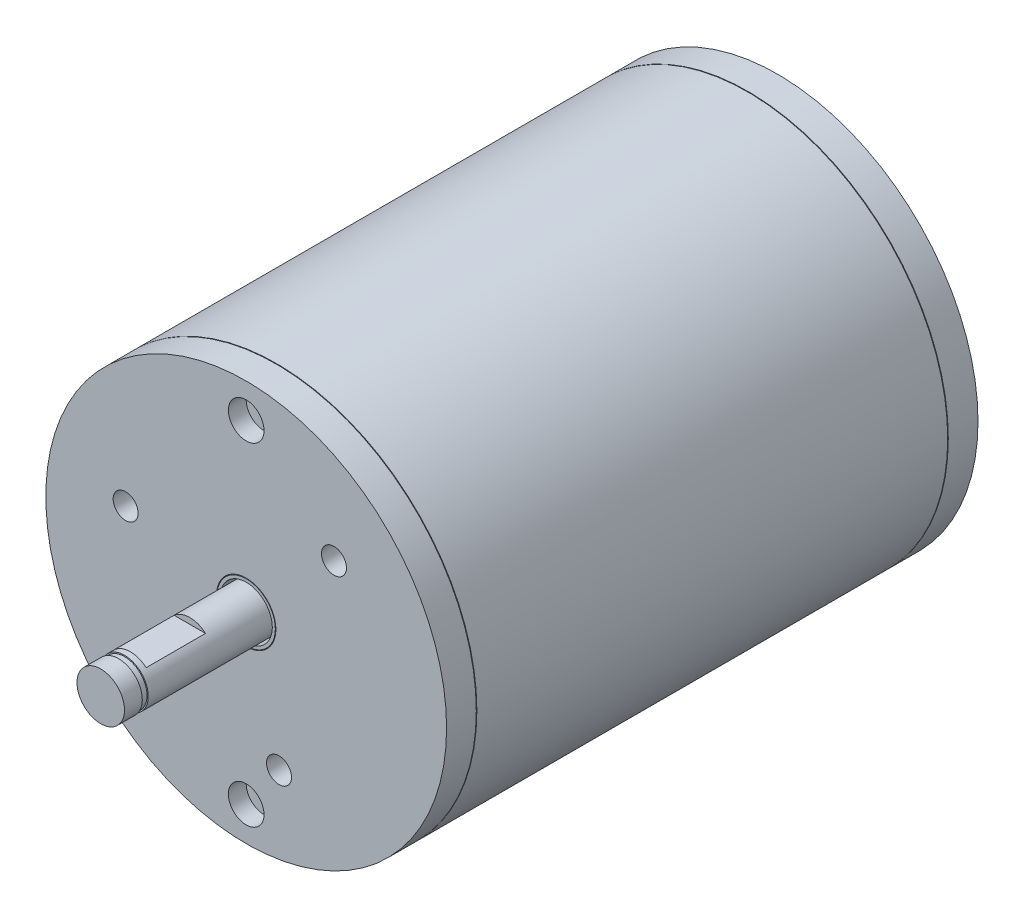
ISO-10303-21;
HEADER;
FILE_DESCRIPTION(('STEP AP214'),'2;1');
FILE_NAME('part.step','',(''),(''),'','','');
FILE_SCHEMA(('AUTOMOTIVE_DESIGN { 1 0 10303 214 1 1 1 1 }'));
ENDSEC;
DATA;
#1=APPLICATION_CONTEXT('core data for automotive mechanical design processes');
#2=APPLICATION_PROTOCOL_DEFINITION('international standard','automotive_design',2000,#1);
#3=PRODUCT_CONTEXT('',#1,'mechanical');
#4=PRODUCT('Part','Part','',(#3));
#5=PRODUCT_RELATED_PRODUCT_CATEGORY('part','',(#4));
#6=PRODUCT_DEFINITION_FORMATION('','',#4);
#7=PRODUCT_DEFINITION_CONTEXT('part definition',#1,'design');
#8=PRODUCT_DEFINITION('design','',#6,#7);
#9=PRODUCT_DEFINITION_SHAPE('','',#8);
#10=(LENGTH_UNIT() NAMED_UNIT(*) SI_UNIT(.MILLI.,.METRE.));
#11=(NAMED_UNIT(*) PLANE_ANGLE_UNIT() SI_UNIT($,.RADIAN.));
#12=(NAMED_UNIT(*) SI_UNIT($,.STERADIAN.) SOLID_ANGLE_UNIT());
#13=UNCERTAINTY_MEASURE_WITH_UNIT(LENGTH_MEASURE(1.E-05),#10,'distance_accuracy_value','');
#14=(GEOMETRIC_REPRESENTATION_CONTEXT(3) GLOBAL_UNCERTAINTY_ASSIGNED_CONTEXT((#13)) GLOBAL_UNIT_ASSIGNED_CONTEXT((#10,
#11,#12)) REPRESENTATION_CONTEXT('',''));
#15=CARTESIAN_POINT('',(0.,0.,0.));
#16=DIRECTION('',(0.,0.,1.));
#17=DIRECTION('',(1.,0.,0.));
#18=AXIS2_PLACEMENT_3D('',#15,#16,#17);
#19=CARTESIAN_POINT('',(0.,0.,109.));
#20=DIRECTION('',(0.,0.,-1.));
#21=DIRECTION('',(-1.,0.,0.));
#22=AXIS2_PLACEMENT_3D('',#19,#20,#21);
#23=CYLINDRICAL_SURFACE('',#22,4.);
#24=CARTESIAN_POINT('',(0.,0.,84.5));
#25=DIRECTION('',(0.,0.,1.));
#26=DIRECTION('',(1.,0.,0.));
#27=AXIS2_PLACEMENT_3D('',#24,#25,#26);
#28=CIRCLE('',#27,4.);
#29=CARTESIAN_POINT('',(4.,0.,84.5));
#30=VERTEX_POINT('',#29);
#31=EDGE_CURVE('E123',#30,#30,#28,.T.);
#32=ORIENTED_EDGE('',*,*,#31,.T.);
#33=EDGE_LOOP('',(#32));
#34=FACE_BOUND('',#33,.T.);
#35=CARTESIAN_POINT('',(0.,0.,99.));
#36=DIRECTION('',(0.,0.,1.));
#37=DIRECTION('',(1.,0.,0.));
#38=AXIS2_PLACEMENT_3D('',#35,#36,#37);
#39=CIRCLE('',#38,4.);
#40=CARTESIAN_POINT('',(2.64575131106459,3.,99.));
#41=VERTEX_POINT('',#40);
#42=CARTESIAN_POINT('',(-2.64575131106459,3.,99.));
#43=VERTEX_POINT('',#42);
#44=EDGE_CURVE('E44',#41,#43,#39,.T.);
#45=ORIENTED_EDGE('',*,*,#44,.F.);
#46=DIRECTION('',(0.,0.,-1.));
#47=VECTOR('',#46,1.);
#48=CARTESIAN_POINT('',(2.64575131106459,3.,109.));
#49=LINE('',#48,#47);
#50=CARTESIAN_POINT('',(2.64575131106459,3.,109.));
#51=VERTEX_POINT('',#50);
#52=EDGE_CURVE('E83',#51,#41,#49,.T.);
#53=ORIENTED_EDGE('',*,*,#52,.F.);
#54=CARTESIAN_POINT('',(0.,0.,109.));
#55=DIRECTION('',(0.,0.,1.));
#56=DIRECTION('',(1.,0.,0.));
#57=AXIS2_PLACEMENT_3D('',#54,#55,#56);
#58=CIRCLE('',#57,4.);
#59=CARTESIAN_POINT('',(-2.64575131106459,3.,109.));
#60=VERTEX_POINT('',#59);
#61=EDGE_CURVE('E88',#51,#60,#58,.T.);
#62=ORIENTED_EDGE('',*,*,#61,.T.);
#63=DIRECTION('',(0.,0.,-1.));
#64=VECTOR('',#63,1.);
#65=CARTESIAN_POINT('',(-2.64575131106459,3.,109.));
#66=LINE('',#65,#64);
#67=EDGE_CURVE('E73',#43,#60,#66,.F.);
#68=ORIENTED_EDGE('',*,*,#67,.F.);
#69=EDGE_LOOP('',(#45,#53,#62,#68));
#70=FACE_BOUND('',#69,.T.);
#71=CARTESIAN_POINT('',(0.,0.,110.));
#72=DIRECTION('',(0.,0.,1.));
#73=DIRECTION('',(1.,0.,0.));
#74=AXIS2_PLACEMENT_3D('',#71,#72,#73);
#75=CIRCLE('',#74,4.);
#76=CARTESIAN_POINT('',(4.,0.,110.));
#77=VERTEX_POINT('',#76);
#78=EDGE_CURVE('E91',#77,#77,#75,.T.);
#79=ORIENTED_EDGE('',*,*,#78,.F.);
#80=EDGE_LOOP('',(#79));
#81=FACE_BOUND('',#80,.T.);
#82=ADVANCED_FACE('F40',(#34,#70,#81),#23,.T.);
#83=CARTESIAN_POINT('',(0.,0.,5.));
#84=DIRECTION('',(0.,0.,-1.));
#85=DIRECTION('',(-1.,0.,0.));
#86=AXIS2_PLACEMENT_3D('',#83,#84,#85);
#87=CYLINDRICAL_SURFACE('',#86,33.75);
#88=CARTESIAN_POINT('',(0.,0.,5.));
#89=DIRECTION('',(0.,0.,1.));
#90=DIRECTION('',(1.,0.,0.));
#91=AXIS2_PLACEMENT_3D('',#88,#89,#90);
#92=CIRCLE('',#91,33.75);
#93=CARTESIAN_POINT('',(33.75,0.,5.));
#94=VERTEX_POINT('',#93);
#95=EDGE_CURVE('E169',#94,#94,#92,.T.);
#96=ORIENTED_EDGE('',*,*,#95,.F.);
#97=EDGE_LOOP('',(#96));
#98=FACE_BOUND('',#97,.T.);
#99=CARTESIAN_POINT('',(0.,0.,0.));
#100=DIRECTION('',(0.,0.,1.));
#101=DIRECTION('',(1.,0.,0.));
#102=AXIS2_PLACEMENT_3D('',#99,#100,#101);
#103=CIRCLE('',#102,33.75);
#104=CARTESIAN_POINT('',(33.75,0.,0.));
#105=VERTEX_POINT('',#104);
#106=EDGE_CURVE('E166',#105,#105,#103,.T.);
#107=ORIENTED_EDGE('',*,*,#106,.T.);
#108=EDGE_LOOP('',(#107));
#109=FACE_BOUND('',#108,.T.);
#110=ADVANCED_FACE('F42',(#98,#109),#87,.T.);
#111=CARTESIAN_POINT('',(0.,0.,5.));
#112=DIRECTION('',(0.,0.,1.));
#113=DIRECTION('',(1.,0.,0.));
#114=AXIS2_PLACEMENT_3D('',#111,#112,#113);
#115=PLANE('',#114);
#116=CARTESIAN_POINT('',(0.,0.,5.));
#117=DIRECTION('',(0.,0.,1.));
#118=DIRECTION('',(1.,0.,0.));
#119=AXIS2_PLACEMENT_3D('',#116,#117,#118);
#120=CIRCLE('',#119,33.6);
#121=CARTESIAN_POINT('',(33.6,0.,5.));
#122=VERTEX_POINT('',#121);
#123=EDGE_CURVE('E157',#122,#122,#120,.T.);
#124=ORIENTED_EDGE('',*,*,#123,.F.);
#125=EDGE_LOOP('',(#124));
#126=FACE_BOUND('',#125,.T.);
#127=ORIENTED_EDGE('',*,*,#95,.T.);
#128=EDGE_LOOP('',(#127));
#129=FACE_BOUND('',#128,.T.);
#130=ADVANCED_FACE('F208',(#126,#129),#115,.T.);
#131=CARTESIAN_POINT('',(0.,0.,0.));
#132=DIRECTION('',(0.,0.,1.));
#133=DIRECTION('',(1.,0.,0.));
#134=AXIS2_PLACEMENT_3D('',#131,#132,#133);
#135=PLANE('',#134);
#136=CARTESIAN_POINT('',(0.,0.,0.));
#137=DIRECTION('',(0.,0.,-1.));
#138=DIRECTION('',(-1.,0.,0.));
#139=AXIS2_PLACEMENT_3D('',#136,#137,#138);
#140=CIRCLE('',#139,15.);
#141=CARTESIAN_POINT('',(-15.,0.,0.));
#142=VERTEX_POINT('',#141);
#143=EDGE_CURVE('E89',#142,#142,#140,.T.);
#144=ORIENTED_EDGE('',*,*,#143,.F.);
#145=EDGE_LOOP('',(#144));
#146=FACE_BOUND('',#145,.T.);
#147=ORIENTED_EDGE('',*,*,#106,.F.);
#148=EDGE_LOOP('',(#147));
#149=FACE_BOUND('',#148,.T.);
#150=ADVANCED_FACE('F267',(#146,#149),#135,.F.);
#151=CARTESIAN_POINT('',(0.,0.,5.1));
#152=DIRECTION('',(0.,0.,-1.));
#153=DIRECTION('',(-1.,0.,0.));
#154=AXIS2_PLACEMENT_3D('',#151,#152,#153);
#155=CYLINDRICAL_SURFACE('',#154,33.6);
#156=CARTESIAN_POINT('',(0.,0.,5.1));
#157=DIRECTION('',(0.,0.,1.));
#158=DIRECTION('',(1.,0.,0.));
#159=AXIS2_PLACEMENT_3D('',#156,#157,#158);
#160=CIRCLE('',#159,33.6);
#161=CARTESIAN_POINT('',(33.6,0.,5.1));
#162=VERTEX_POINT('',#161);
#163=EDGE_CURVE('E161',#162,#162,#160,.T.);
#164=ORIENTED_EDGE('',*,*,#163,.F.);
#165=EDGE_LOOP('',(#164));
#166=FACE_BOUND('',#165,.T.);
#167=ORIENTED_EDGE('',*,*,#123,.T.);
#168=EDGE_LOOP('',(#167));
#169=FACE_BOUND('',#168,.T.);
#170=ADVANCED_FACE('F263',(#166,#169),#155,.T.);
#171=CARTESIAN_POINT('',(0.,0.,84.4));
#172=DIRECTION('',(0.,0.,-1.));
#173=DIRECTION('',(-1.,0.,0.));
#174=AXIS2_PLACEMENT_3D('',#171,#172,#173);
#175=CYLINDRICAL_SURFACE('',#174,33.75);
#176=CARTESIAN_POINT('',(0.,0.,84.4));
#177=DIRECTION('',(0.,0.,1.));
#178=DIRECTION('',(1.,0.,0.));
#179=AXIS2_PLACEMENT_3D('',#176,#177,#178);
#180=CIRCLE('',#179,33.75);
#181=CARTESIAN_POINT('',(33.75,0.,84.4));
#182=VERTEX_POINT('',#181);
#183=EDGE_CURVE('E158',#182,#182,#180,.T.);
#184=ORIENTED_EDGE('',*,*,#183,.F.);
#185=EDGE_LOOP('',(#184));
#186=FACE_BOUND('',#185,.T.);
#187=CARTESIAN_POINT('',(0.,0.,5.1));
#188=DIRECTION('',(0.,0.,1.));
#189=DIRECTION('',(1.,0.,0.));
#190=AXIS2_PLACEMENT_3D('',#187,#188,#189);
#191=CIRCLE('',#190,33.75);
#192=CARTESIAN_POINT('',(33.75,0.,5.1));
#193=VERTEX_POINT('',#192);
#194=EDGE_CURVE('E153',#193,#193,#191,.T.);
#195=ORIENTED_EDGE('',*,*,#194,.T.);
#196=EDGE_LOOP('',(#195));
#197=FACE_BOUND('',#196,.T.);
#198=ADVANCED_FACE('F256',(#186,#197),#175,.T.);
#199=CARTESIAN_POINT('',(0.,0.,84.4));
#200=DIRECTION('',(0.,0.,1.));
#201=DIRECTION('',(1.,0.,0.));
#202=AXIS2_PLACEMENT_3D('',#199,#200,#201);
#203=PLANE('',#202);
#204=CARTESIAN_POINT('',(0.,0.,84.4));
#205=DIRECTION('',(0.,0.,1.));
#206=DIRECTION('',(1.,0.,0.));
#207=AXIS2_PLACEMENT_3D('',#204,#205,#206);
#208=CIRCLE('',#207,33.6);
#209=CARTESIAN_POINT('',(33.6,0.,84.4));
#210=VERTEX_POINT('',#209);
#211=EDGE_CURVE('E154',#210,#210,#208,.T.);
#212=ORIENTED_EDGE('',*,*,#211,.F.);
#213=EDGE_LOOP('',(#212));
#214=FACE_BOUND('',#213,.T.);
#215=ORIENTED_EDGE('',*,*,#183,.T.);
#216=EDGE_LOOP('',(#215));
#217=FACE_BOUND('',#216,.T.);
#218=ADVANCED_FACE('F253',(#214,#217),#203,.T.);
#219=CARTESIAN_POINT('',(0.,0.,5.1));
#220=DIRECTION('',(0.,0.,1.));
#221=DIRECTION('',(1.,0.,0.));
#222=AXIS2_PLACEMENT_3D('',#219,#220,#221);
#223=PLANE('',#222);
#224=ORIENTED_EDGE('',*,*,#163,.T.);
#225=EDGE_LOOP('',(#224));
#226=FACE_BOUND('',#225,.T.);
#227=ORIENTED_EDGE('',*,*,#194,.F.);
#228=EDGE_LOOP('',(#227));
#229=FACE_BOUND('',#228,.T.);
#230=ADVANCED_FACE('F251',(#226,#229),#223,.F.);
#231=CARTESIAN_POINT('',(0.,0.,84.5));
#232=DIRECTION('',(0.,0.,-1.));
#233=DIRECTION('',(-1.,0.,0.));
#234=AXIS2_PLACEMENT_3D('',#231,#232,#233);
#235=CYLINDRICAL_SURFACE('',#234,33.6);
#236=CARTESIAN_POINT('',(0.,0.,84.5));
#237=DIRECTION('',(0.,0.,1.));
#238=DIRECTION('',(1.,0.,0.));
#239=AXIS2_PLACEMENT_3D('',#236,#237,#238);
#240=CIRCLE('',#239,33.6);
#241=CARTESIAN_POINT('',(33.6,0.,84.5));
#242=VERTEX_POINT('',#241);
#243=EDGE_CURVE('E148',#242,#242,#240,.T.);
#244=ORIENTED_EDGE('',*,*,#243,.F.);
#245=EDGE_LOOP('',(#244));
#246=FACE_BOUND('',#245,.T.);
#247=ORIENTED_EDGE('',*,*,#211,.T.);
#248=EDGE_LOOP('',(#247));
#249=FACE_BOUND('',#248,.T.);
#250=ADVANCED_FACE('F239',(#246,#249),#235,.T.);
#251=CARTESIAN_POINT('',(0.,0.,89.5));
#252=DIRECTION('',(0.,0.,-1.));
#253=DIRECTION('',(-1.,0.,0.));
#254=AXIS2_PLACEMENT_3D('',#251,#252,#253);
#255=CYLINDRICAL_SURFACE('',#254,33.75);
#256=CARTESIAN_POINT('',(0.,0.,89.5));
#257=DIRECTION('',(0.,0.,1.));
#258=DIRECTION('',(1.,0.,0.));
#259=AXIS2_PLACEMENT_3D('',#256,#257,#258);
#260=CIRCLE('',#259,33.75);
#261=CARTESIAN_POINT('',(33.75,0.,89.5));
#262=VERTEX_POINT('',#261);
#263=EDGE_CURVE('E145',#262,#262,#260,.T.);
#264=ORIENTED_EDGE('',*,*,#263,.F.);
#265=EDGE_LOOP('',(#264));
#266=FACE_BOUND('',#265,.T.);
#267=CARTESIAN_POINT('',(0.,0.,84.5));
#268=DIRECTION('',(0.,0.,1.));
#269=DIRECTION('',(1.,0.,0.));
#270=AXIS2_PLACEMENT_3D('',#267,#268,#269);
#271=CIRCLE('',#270,33.75);
#272=CARTESIAN_POINT('',(33.75,0.,84.5));
#273=VERTEX_POINT('',#272);
#274=EDGE_CURVE('E142',#273,#273,#271,.T.);
#275=ORIENTED_EDGE('',*,*,#274,.T.);
#276=EDGE_LOOP('',(#275));
#277=FACE_BOUND('',#276,.T.);
#278=ADVANCED_FACE('F232',(#266,#277),#255,.T.);
#279=CARTESIAN_POINT('',(0.,0.,89.5));
#280=DIRECTION('',(0.,0.,1.));
#281=DIRECTION('',(1.,0.,0.));
#282=AXIS2_PLACEMENT_3D('',#279,#280,#281);
#283=PLANE('',#282);
#284=CARTESIAN_POINT('',(0.,28.,89.5));
#285=DIRECTION('',(0.,0.,1.));
#286=DIRECTION('',(1.,0.,0.));
#287=AXIS2_PLACEMENT_3D('',#284,#285,#286);
#288=CIRCLE('',#287,3.);
#289=CARTESIAN_POINT('',(3.,28.,89.5));
#290=VERTEX_POINT('',#289);
#291=EDGE_CURVE('E624',#290,#290,#288,.T.);
#292=ORIENTED_EDGE('',*,*,#291,.F.);
#293=EDGE_LOOP('',(#292));
#294=FACE_BOUND('',#293,.T.);
#295=CARTESIAN_POINT('',(0.,-28.,89.5));
#296=DIRECTION('',(0.,0.,1.));
#297=DIRECTION('',(1.,0.,0.));
#298=AXIS2_PLACEMENT_3D('',#295,#296,#297);
#299=CIRCLE('',#298,3.);
#300=CARTESIAN_POINT('',(3.,-28.,89.5));
#301=VERTEX_POINT('',#300);
#302=EDGE_CURVE('E627',#301,#301,#299,.T.);
#303=ORIENTED_EDGE('',*,*,#302,.F.);
#304=EDGE_LOOP('',(#303));
#305=FACE_BOUND('',#304,.T.);
#306=CARTESIAN_POINT('',(-20.3083905759157,5.34502312586563,89.5));
#307=DIRECTION('',(0.,0.,1.));
#308=DIRECTION('',(1.,0.,0.));
#309=AXIS2_PLACEMENT_3D('',#306,#307,#308);
#310=CIRCLE('',#309,2.1);
#311=CARTESIAN_POINT('',(-18.2083905759157,5.34502312586563,89.5));
#312=VERTEX_POINT('',#311);
#313=EDGE_CURVE('E102',#312,#312,#310,.T.);
#314=ORIENTED_EDGE('',*,*,#313,.F.);
#315=EDGE_LOOP('',(#314));
#316=FACE_BOUND('',#315,.T.);
#317=CARTESIAN_POINT('',(14.7831210987738,14.9150705857864,89.5));
#318=DIRECTION('',(0.,0.,1.));
#319=DIRECTION('',(1.,0.,0.));
#320=AXIS2_PLACEMENT_3D('',#317,#318,#319);
#321=CIRCLE('',#320,2.1);
#322=CARTESIAN_POINT('',(16.8831210987738,14.9150705857864,89.5));
#323=VERTEX_POINT('',#322);
#324=EDGE_CURVE('E108',#323,#323,#321,.T.);
#325=ORIENTED_EDGE('',*,*,#324,.F.);
#326=EDGE_LOOP('',(#325));
#327=FACE_BOUND('',#326,.T.);
#328=CARTESIAN_POINT('',(5.52526947714316,-20.2600937116533,89.5));
#329=DIRECTION('',(0.,0.,1.));
#330=DIRECTION('',(1.,0.,0.));
#331=AXIS2_PLACEMENT_3D('',#328,#329,#330);
#332=CIRCLE('',#331,2.1);
#333=CARTESIAN_POINT('',(7.62526947714316,-20.2600937116533,89.5));
#334=VERTEX_POINT('',#333);
#335=EDGE_CURVE('E114',#334,#334,#332,.T.);
#336=ORIENTED_EDGE('',*,*,#335,.F.);
#337=EDGE_LOOP('',(#336));
#338=FACE_BOUND('',#337,.T.);
#339=CARTESIAN_POINT('',(0.,0.,89.5));
#340=DIRECTION('',(0.,0.,1.));
#341=DIRECTION('',(1.,0.,0.));
#342=AXIS2_PLACEMENT_3D('',#339,#340,#341);
#343=CIRCLE('',#342,5.);
#344=CARTESIAN_POINT('',(5.,0.,89.5));
#345=VERTEX_POINT('',#344);
#346=EDGE_CURVE('E136',#345,#345,#343,.T.);
#347=ORIENTED_EDGE('',*,*,#346,.F.);
#348=EDGE_LOOP('',(#347));
#349=FACE_BOUND('',#348,.T.);
#350=ORIENTED_EDGE('',*,*,#263,.T.);
#351=EDGE_LOOP('',(#350));
#352=FACE_BOUND('',#351,.T.);
#353=ADVANCED_FACE('F229',(#294,#305,#316,#327,#338,#349,#352),#283,.T.);
#354=CARTESIAN_POINT('',(0.,0.,84.5));
#355=DIRECTION('',(0.,0.,1.));
#356=DIRECTION('',(1.,0.,0.));
#357=AXIS2_PLACEMENT_3D('',#354,#355,#356);
#358=PLANE('',#357);
#359=ORIENTED_EDGE('',*,*,#243,.T.);
#360=EDGE_LOOP('',(#359));
#361=FACE_BOUND('',#360,.T.);
#362=ORIENTED_EDGE('',*,*,#274,.F.);
#363=EDGE_LOOP('',(#362));
#364=FACE_BOUND('',#363,.T.);
#365=ADVANCED_FACE('F226',(#361,#364),#358,.F.);
#366=CARTESIAN_POINT('',(0.,0.,84.5));
#367=DIRECTION('',(0.,0.,1.));
#368=DIRECTION('',(1.,0.,0.));
#369=AXIS2_PLACEMENT_3D('',#366,#367,#368);
#370=CYLINDRICAL_SURFACE('',#369,5.);
#371=CARTESIAN_POINT('',(0.,0.,84.5));
#372=DIRECTION('',(0.,0.,1.));
#373=DIRECTION('',(1.,0.,0.));
#374=AXIS2_PLACEMENT_3D('',#371,#372,#373);
#375=CIRCLE('',#374,5.);
#376=CARTESIAN_POINT('',(5.,0.,84.5));
#377=VERTEX_POINT('',#376);
#378=EDGE_CURVE('E139',#377,#377,#375,.T.);
#379=ORIENTED_EDGE('',*,*,#378,.F.);
#380=EDGE_LOOP('',(#379));
#381=FACE_BOUND('',#380,.T.);
#382=ORIENTED_EDGE('',*,*,#346,.T.);
#383=EDGE_LOOP('',(#382));
#384=FACE_BOUND('',#383,.T.);
#385=ADVANCED_FACE('F200',(#381,#384),#370,.F.);
#386=CARTESIAN_POINT('',(0.,0.,84.5));
#387=DIRECTION('',(0.,0.,1.));
#388=DIRECTION('',(1.,0.,0.));
#389=AXIS2_PLACEMENT_3D('',#386,#387,#388);
#390=PLANE('',#389);
#391=CARTESIAN_POINT('',(0.,0.,84.5));
#392=DIRECTION('',(0.,0.,1.));
#393=DIRECTION('',(1.,0.,0.));
#394=AXIS2_PLACEMENT_3D('',#391,#392,#393);
#395=CIRCLE('',#394,4.9);
#396=CARTESIAN_POINT('',(4.9,0.,84.5));
#397=VERTEX_POINT('',#396);
#398=EDGE_CURVE('E132',#397,#397,#395,.T.);
#399=ORIENTED_EDGE('',*,*,#398,.F.);
#400=EDGE_LOOP('',(#399));
#401=FACE_BOUND('',#400,.T.);
#402=ORIENTED_EDGE('',*,*,#378,.T.);
#403=EDGE_LOOP('',(#402));
#404=FACE_BOUND('',#403,.T.);
#405=ADVANCED_FACE('F184',(#401,#404),#390,.T.);
#406=CARTESIAN_POINT('',(0.,0.,89.5));
#407=DIRECTION('',(0.,0.,1.));
#408=DIRECTION('',(1.,0.,0.));
#409=AXIS2_PLACEMENT_3D('',#406,#407,#408);
#410=PLANE('',#409);
#411=CARTESIAN_POINT('',(0.,0.,89.5));
#412=DIRECTION('',(0.,0.,1.));
#413=DIRECTION('',(1.,0.,0.));
#414=AXIS2_PLACEMENT_3D('',#411,#412,#413);
#415=CIRCLE('',#414,4.9);
#416=CARTESIAN_POINT('',(4.9,0.,89.5));
#417=VERTEX_POINT('',#416);
#418=EDGE_CURVE('E133',#417,#417,#415,.T.);
#419=ORIENTED_EDGE('',*,*,#418,.T.);
#420=EDGE_LOOP('',(#419));
#421=FACE_BOUND('',#420,.T.);
#422=CARTESIAN_POINT('',(0.,0.,89.5));
#423=DIRECTION('',(0.,0.,1.));
#424=DIRECTION('',(1.,0.,0.));
#425=AXIS2_PLACEMENT_3D('',#422,#423,#424);
#426=CIRCLE('',#425,4.4);
#427=CARTESIAN_POINT('',(4.4,0.,89.5));
#428=VERTEX_POINT('',#427);
#429=EDGE_CURVE('E129',#428,#428,#426,.T.);
#430=ORIENTED_EDGE('',*,*,#429,.F.);
#431=EDGE_LOOP('',(#430));
#432=FACE_BOUND('',#431,.T.);
#433=ADVANCED_FACE('F199',(#421,#432),#410,.T.);
#434=CARTESIAN_POINT('',(0.,0.,89.5));
#435=DIRECTION('',(0.,0.,-1.));
#436=DIRECTION('',(-1.,0.,0.));
#437=AXIS2_PLACEMENT_3D('',#434,#435,#436);
#438=CYLINDRICAL_SURFACE('',#437,4.9);
#439=ORIENTED_EDGE('',*,*,#418,.F.);
#440=EDGE_LOOP('',(#439));
#441=FACE_BOUND('',#440,.T.);
#442=ORIENTED_EDGE('',*,*,#398,.T.);
#443=EDGE_LOOP('',(#442));
#444=FACE_BOUND('',#443,.T.);
#445=ADVANCED_FACE('F192',(#441,#444),#438,.T.);
#446=CARTESIAN_POINT('',(0.,0.,89.5));
#447=DIRECTION('',(0.,0.,-1.));
#448=DIRECTION('',(-1.,0.,0.));
#449=AXIS2_PLACEMENT_3D('',#446,#447,#448);
#450=CYLINDRICAL_SURFACE('',#449,4.4);
#451=ORIENTED_EDGE('',*,*,#429,.T.);
#452=EDGE_LOOP('',(#451));
#453=FACE_BOUND('',#452,.T.);
#454=CARTESIAN_POINT('',(0.,0.,84.5));
#455=DIRECTION('',(0.,0.,1.));
#456=DIRECTION('',(1.,0.,0.));
#457=AXIS2_PLACEMENT_3D('',#454,#455,#456);
#458=CIRCLE('',#457,4.4);
#459=CARTESIAN_POINT('',(4.4,0.,84.5));
#460=VERTEX_POINT('',#459);
#461=EDGE_CURVE('E126',#460,#460,#458,.F.);
#462=ORIENTED_EDGE('',*,*,#461,.T.);
#463=EDGE_LOOP('',(#462));
#464=FACE_BOUND('',#463,.T.);
#465=ADVANCED_FACE('F177',(#453,#464),#450,.F.);
#466=ORIENTED_EDGE('',*,*,#31,.F.);
#467=EDGE_LOOP('',(#466));
#468=FACE_BOUND('',#467,.T.);
#469=ORIENTED_EDGE('',*,*,#461,.F.);
#470=EDGE_LOOP('',(#469));
#471=FACE_BOUND('',#470,.T.);
#472=ADVANCED_FACE('F179',(#468,#471),#390,.T.);
#473=CARTESIAN_POINT('',(0.,0.,-9.91));
#474=DIRECTION('',(0.,0.,1.));
#475=DIRECTION('',(1.,0.,0.));
#476=AXIS2_PLACEMENT_3D('',#473,#474,#475);
#477=CYLINDRICAL_SURFACE('',#476,15.);
#478=CARTESIAN_POINT('',(0.,0.,-9.91));
#479=DIRECTION('',(0.,0.,-1.));
#480=DIRECTION('',(-1.,0.,0.));
#481=AXIS2_PLACEMENT_3D('',#478,#479,#480);
#482=CIRCLE('',#481,15.);
#483=CARTESIAN_POINT('',(-15.,0.,-9.91));
#484=VERTEX_POINT('',#483);
#485=EDGE_CURVE('E120',#484,#484,#482,.T.);
#486=ORIENTED_EDGE('',*,*,#485,.F.);
#487=EDGE_LOOP('',(#486));
#488=FACE_BOUND('',#487,.T.);
#489=ORIENTED_EDGE('',*,*,#143,.T.);
#490=EDGE_LOOP('',(#489));
#491=FACE_BOUND('',#490,.T.);
#492=ADVANCED_FACE('F181',(#488,#491),#477,.T.);
#493=CARTESIAN_POINT('',(0.,0.,-9.91));
#494=DIRECTION('',(0.,0.,-1.));
#495=DIRECTION('',(-1.,0.,0.));
#496=AXIS2_PLACEMENT_3D('',#493,#494,#495);
#497=PLANE('',#496);
#498=ORIENTED_EDGE('',*,*,#485,.T.);
#499=EDGE_LOOP('',(#498));
#500=FACE_BOUND('',#499,.T.);
#501=ADVANCED_FACE('F189',(#500),#497,.T.);
#502=CARTESIAN_POINT('',(5.52526947714316,-20.2600937116533,84.5));
#503=DIRECTION('',(0.,0.,1.));
#504=DIRECTION('',(1.,0.,0.));
#505=AXIS2_PLACEMENT_3D('',#502,#503,#504);
#506=CONICAL_SURFACE('',#505,2.1,1.02974425867666);
#507=CARTESIAN_POINT('',(5.52526947714315,-20.2600937116533,83.2381927000421));
#508=VERTEX_POINT('',#507);
#509=VERTEX_LOOP('',#508);
#510=FACE_BOUND('',#509,.T.);
#511=CARTESIAN_POINT('',(5.52526947714316,-20.2600937116533,84.5));
#512=DIRECTION('',(0.,0.,1.));
#513=DIRECTION('',(1.,0.,0.));
#514=AXIS2_PLACEMENT_3D('',#511,#512,#513);
#515=CIRCLE('',#514,2.1);
#516=CARTESIAN_POINT('',(7.62526947714315,-20.2600937116533,84.5));
#517=VERTEX_POINT('',#516);
#518=EDGE_CURVE('E117',#517,#517,#515,.T.);
#519=ORIENTED_EDGE('',*,*,#518,.T.);
#520=EDGE_LOOP('',(#519));
#521=FACE_BOUND('',#520,.T.);
#522=ADVANCED_FACE('F409',(#510,#521),#506,.F.);
#523=CARTESIAN_POINT('',(5.52526947714316,-20.2600937116533,89.5));
#524=DIRECTION('',(0.,0.,1.));
#525=DIRECTION('',(1.,0.,0.));
#526=AXIS2_PLACEMENT_3D('',#523,#524,#525);
#527=CYLINDRICAL_SURFACE('',#526,2.1);
#528=ORIENTED_EDGE('',*,*,#518,.F.);
#529=EDGE_LOOP('',(#528));
#530=FACE_BOUND('',#529,.T.);
#531=ORIENTED_EDGE('',*,*,#335,.T.);
#532=EDGE_LOOP('',(#531));
#533=FACE_BOUND('',#532,.T.);
#534=ADVANCED_FACE('F406',(#530,#533),#527,.F.);
#535=CARTESIAN_POINT('',(14.7831210987738,14.9150705857864,84.5));
#536=DIRECTION('',(0.,0.,1.));
#537=DIRECTION('',(1.,0.,0.));
#538=AXIS2_PLACEMENT_3D('',#535,#536,#537);
#539=CONICAL_SURFACE('',#538,2.1,1.02974425867666);
#540=CARTESIAN_POINT('',(14.7831210987738,14.9150705857864,83.2381927000421));
#541=VERTEX_POINT('',#540);
#542=VERTEX_LOOP('',#541);
#543=FACE_BOUND('',#542,.T.);
#544=CARTESIAN_POINT('',(14.7831210987738,14.9150705857864,84.5));
#545=DIRECTION('',(0.,0.,1.));
#546=DIRECTION('',(1.,0.,0.));
#547=AXIS2_PLACEMENT_3D('',#544,#545,#546);
#548=CIRCLE('',#547,2.1);
#549=CARTESIAN_POINT('',(16.8831210987738,14.9150705857864,84.5));
#550=VERTEX_POINT('',#549);
#551=EDGE_CURVE('E111',#550,#550,#548,.T.);
#552=ORIENTED_EDGE('',*,*,#551,.T.);
#553=EDGE_LOOP('',(#552));
#554=FACE_BOUND('',#553,.T.);
#555=ADVANCED_FACE('F402',(#543,#554),#539,.F.);
#556=CARTESIAN_POINT('',(14.7831210987738,14.9150705857864,89.5));
#557=DIRECTION('',(0.,0.,1.));
#558=DIRECTION('',(1.,0.,0.));
#559=AXIS2_PLACEMENT_3D('',#556,#557,#558);
#560=CYLINDRICAL_SURFACE('',#559,2.1);
#561=ORIENTED_EDGE('',*,*,#551,.F.);
#562=EDGE_LOOP('',(#561));
#563=FACE_BOUND('',#562,.T.);
#564=ORIENTED_EDGE('',*,*,#324,.T.);
#565=EDGE_LOOP('',(#564));
#566=FACE_BOUND('',#565,.T.);
#567=ADVANCED_FACE('F398',(#563,#566),#560,.F.);
#568=CARTESIAN_POINT('',(-20.3083905759157,5.34502312586563,84.5));
#569=DIRECTION('',(0.,0.,1.));
#570=DIRECTION('',(1.,0.,0.));
#571=AXIS2_PLACEMENT_3D('',#568,#569,#570);
#572=CONICAL_SURFACE('',#571,2.1,1.02974425867666);
#573=CARTESIAN_POINT('',(-20.3083905759157,5.34502312586563,83.2381927000421));
#574=VERTEX_POINT('',#573);
#575=VERTEX_LOOP('',#574);
#576=FACE_BOUND('',#575,.T.);
#577=CARTESIAN_POINT('',(-20.3083905759157,5.34502312586563,84.5));
#578=DIRECTION('',(0.,0.,1.));
#579=DIRECTION('',(1.,0.,0.));
#580=AXIS2_PLACEMENT_3D('',#577,#578,#579);
#581=CIRCLE('',#580,2.1);
#582=CARTESIAN_POINT('',(-18.2083905759157,5.34502312586563,84.5));
#583=VERTEX_POINT('',#582);
#584=EDGE_CURVE('E105',#583,#583,#581,.T.);
#585=ORIENTED_EDGE('',*,*,#584,.T.);
#586=EDGE_LOOP('',(#585));
#587=FACE_BOUND('',#586,.T.);
#588=ADVANCED_FACE('F394',(#576,#587),#572,.F.);
#589=CARTESIAN_POINT('',(-20.3083905759157,5.34502312586563,89.5));
#590=DIRECTION('',(0.,0.,1.));
#591=DIRECTION('',(1.,0.,0.));
#592=AXIS2_PLACEMENT_3D('',#589,#590,#591);
#593=CYLINDRICAL_SURFACE('',#592,2.1);
#594=ORIENTED_EDGE('',*,*,#584,.F.);
#595=EDGE_LOOP('',(#594));
#596=FACE_BOUND('',#595,.T.);
#597=ORIENTED_EDGE('',*,*,#313,.T.);
#598=EDGE_LOOP('',(#597));
#599=FACE_BOUND('',#598,.T.);
#600=ADVANCED_FACE('F390',(#596,#599),#593,.F.);
#601=CARTESIAN_POINT('',(-4.,3.,99.));
#602=DIRECTION('',(0.,0.,1.));
#603=DIRECTION('',(1.,0.,0.));
#604=AXIS2_PLACEMENT_3D('',#601,#602,#603);
#605=PLANE('',#604);
#606=DIRECTION('',(1.,0.,0.));
#607=VECTOR('',#606,1.);
#608=CARTESIAN_POINT('',(-4.,3.,99.));
#609=LINE('',#608,#607);
#610=EDGE_CURVE('E80',#43,#41,#609,.T.);
#611=ORIENTED_EDGE('',*,*,#610,.T.);
#612=ORIENTED_EDGE('',*,*,#44,.T.);
#613=EDGE_LOOP('',(#611,#612));
#614=FACE_BOUND('',#613,.T.);
#615=ADVANCED_FACE('F387',(#614),#605,.T.);
#616=CARTESIAN_POINT('',(0.,3.,0.));
#617=DIRECTION('',(0.,1.,0.));
#618=DIRECTION('',(0.,0.,1.));
#619=AXIS2_PLACEMENT_3D('',#616,#617,#618);
#620=PLANE('',#619);
#621=ORIENTED_EDGE('',*,*,#52,.T.);
#622=ORIENTED_EDGE('',*,*,#610,.F.);
#623=ORIENTED_EDGE('',*,*,#67,.T.);
#624=DIRECTION('',(-1.,0.,0.));
#625=VECTOR('',#624,1.);
#626=CARTESIAN_POINT('',(0.,3.,109.));
#627=LINE('',#626,#625);
#628=EDGE_CURVE('E77',#51,#60,#627,.T.);
#629=ORIENTED_EDGE('',*,*,#628,.F.);
#630=EDGE_LOOP('',(#621,#622,#623,#629));
#631=FACE_BOUND('',#630,.T.);
#632=ADVANCED_FACE('F76',(#631),#620,.T.);
#633=CARTESIAN_POINT('',(0.,0.,109.));
#634=DIRECTION('',(0.,0.,1.));
#635=DIRECTION('',(1.,0.,0.));
#636=AXIS2_PLACEMENT_3D('',#633,#634,#635);
#637=PLANE('',#636);
#638=ORIENTED_EDGE('',*,*,#61,.F.);
#639=ORIENTED_EDGE('',*,*,#628,.T.);
#640=EDGE_LOOP('',(#638,#639));
#641=FACE_BOUND('',#640,.T.);
#642=ADVANCED_FACE('F87',(#641),#637,.F.);
#643=CARTESIAN_POINT('',(0.,0.,110.));
#644=DIRECTION('',(0.,0.,1.));
#645=DIRECTION('',(1.,0.,0.));
#646=AXIS2_PLACEMENT_3D('',#643,#644,#645);
#647=PLANE('',#646);
#648=CARTESIAN_POINT('',(0.,0.,110.));
#649=DIRECTION('',(0.,0.,1.));
#650=DIRECTION('',(1.,0.,0.));
#651=AXIS2_PLACEMENT_3D('',#648,#649,#650);
#652=CIRCLE('',#651,3.8);
#653=CARTESIAN_POINT('',(3.8,0.,110.));
#654=VERTEX_POINT('',#653);
#655=EDGE_CURVE('E11',#654,#654,#652,.T.);
#656=ORIENTED_EDGE('',*,*,#655,.F.);
#657=EDGE_LOOP('',(#656));
#658=FACE_BOUND('',#657,.T.);
#659=ORIENTED_EDGE('',*,*,#78,.T.);
#660=EDGE_LOOP('',(#659));
#661=FACE_BOUND('',#660,.T.);
#662=ADVANCED_FACE('F378',(#658,#661),#647,.T.);
#663=CARTESIAN_POINT('',(0.,0.,111.));
#664=DIRECTION('',(0.,0.,-1.));
#665=DIRECTION('',(-1.,0.,0.));
#666=AXIS2_PLACEMENT_3D('',#663,#664,#665);
#667=CYLINDRICAL_SURFACE('',#666,3.8);
#668=CARTESIAN_POINT('',(0.,0.,111.));
#669=DIRECTION('',(0.,0.,1.));
#670=DIRECTION('',(1.,0.,0.));
#671=AXIS2_PLACEMENT_3D('',#668,#669,#670);
#672=CIRCLE('',#671,3.8);
#673=CARTESIAN_POINT('',(3.8,0.,111.));
#674=VERTEX_POINT('',#673);
#675=EDGE_CURVE('E92',#674,#674,#672,.T.);
#676=ORIENTED_EDGE('',*,*,#675,.F.);
#677=EDGE_LOOP('',(#676));
#678=FACE_BOUND('',#677,.T.);
#679=ORIENTED_EDGE('',*,*,#655,.T.);
#680=EDGE_LOOP('',(#679));
#681=FACE_BOUND('',#680,.T.);
#682=ADVANCED_FACE('F374',(#678,#681),#667,.T.);
#683=CARTESIAN_POINT('',(0.,0.,114.));
#684=DIRECTION('',(0.,0.,-1.));
#685=DIRECTION('',(-1.,0.,0.));
#686=AXIS2_PLACEMENT_3D('',#683,#684,#685);
#687=CYLINDRICAL_SURFACE('',#686,4.);
#688=CARTESIAN_POINT('',(0.,0.,114.));
#689=DIRECTION('',(0.,0.,1.));
#690=DIRECTION('',(1.,0.,0.));
#691=AXIS2_PLACEMENT_3D('',#688,#689,#690);
#692=CIRCLE('',#691,4.);
#693=CARTESIAN_POINT('',(4.,0.,114.));
#694=VERTEX_POINT('',#693);
#695=EDGE_CURVE('E97',#694,#694,#692,.T.);
#696=ORIENTED_EDGE('',*,*,#695,.F.);
#697=EDGE_LOOP('',(#696));
#698=FACE_BOUND('',#697,.T.);
#699=CARTESIAN_POINT('',(0.,0.,111.));
#700=DIRECTION('',(0.,0.,1.));
#701=DIRECTION('',(1.,0.,0.));
#702=AXIS2_PLACEMENT_3D('',#699,#700,#701);
#703=CIRCLE('',#702,4.);
#704=CARTESIAN_POINT('',(4.,0.,111.));
#705=VERTEX_POINT('',#704);
#706=EDGE_CURVE('E618',#705,#705,#703,.T.);
#707=ORIENTED_EDGE('',*,*,#706,.T.);
#708=EDGE_LOOP('',(#707));
#709=FACE_BOUND('',#708,.T.);
#710=ADVANCED_FACE('F368',(#698,#709),#687,.T.);
#711=CARTESIAN_POINT('',(0.,0.,114.));
#712=DIRECTION('',(0.,0.,1.));
#713=DIRECTION('',(1.,0.,0.));
#714=AXIS2_PLACEMENT_3D('',#711,#712,#713);
#715=PLANE('',#714);
#716=ORIENTED_EDGE('',*,*,#695,.T.);
#717=EDGE_LOOP('',(#716));
#718=FACE_BOUND('',#717,.T.);
#719=ADVANCED_FACE('F365',(#718),#715,.T.);
#720=CARTESIAN_POINT('',(0.,0.,111.));
#721=DIRECTION('',(0.,0.,1.));
#722=DIRECTION('',(1.,0.,0.));
#723=AXIS2_PLACEMENT_3D('',#720,#721,#722);
#724=PLANE('',#723);
#725=ORIENTED_EDGE('',*,*,#675,.T.);
#726=EDGE_LOOP('',(#725));
#727=FACE_BOUND('',#726,.T.);
#728=ORIENTED_EDGE('',*,*,#706,.F.);
#729=EDGE_LOOP('',(#728));
#730=FACE_BOUND('',#729,.T.);
#731=ADVANCED_FACE('F319',(#727,#730),#724,.F.);
#732=CARTESIAN_POINT('',(0.,-28.,86.5));
#733=DIRECTION('',(0.,0.,1.));
#734=DIRECTION('',(1.,0.,0.));
#735=AXIS2_PLACEMENT_3D('',#732,#733,#734);
#736=CYLINDRICAL_SURFACE('',#735,3.);
#737=CARTESIAN_POINT('',(0.,-28.,86.5));
#738=DIRECTION('',(0.,0.,1.));
#739=DIRECTION('',(1.,0.,0.));
#740=AXIS2_PLACEMENT_3D('',#737,#738,#739);
#741=CIRCLE('',#740,3.);
#742=CARTESIAN_POINT('',(3.,-28.,86.5));
#743=VERTEX_POINT('',#742);
#744=EDGE_CURVE('E630',#743,#743,#741,.T.);
#745=ORIENTED_EDGE('',*,*,#744,.F.);
#746=EDGE_LOOP('',(#745));
#747=FACE_BOUND('',#746,.T.);
#748=ORIENTED_EDGE('',*,*,#302,.T.);
#749=EDGE_LOOP('',(#748));
#750=FACE_BOUND('',#749,.T.);
#751=ADVANCED_FACE('F324',(#747,#750),#736,.F.);
#752=CARTESIAN_POINT('',(0.,-28.,86.5));
#753=DIRECTION('',(0.,0.,1.));
#754=DIRECTION('',(1.,0.,0.));
#755=AXIS2_PLACEMENT_3D('',#752,#753,#754);
#756=PLANE('',#755);
#757=ORIENTED_EDGE('',*,*,#744,.T.);
#758=EDGE_LOOP('',(#757));
#759=FACE_BOUND('',#758,.T.);
#760=ADVANCED_FACE('F329',(#759),#756,.T.);
#761=CARTESIAN_POINT('',(0.,28.,86.5));
#762=DIRECTION('',(0.,0.,1.));
#763=DIRECTION('',(1.,0.,0.));
#764=AXIS2_PLACEMENT_3D('',#761,#762,#763);
#765=CYLINDRICAL_SURFACE('',#764,3.);
#766=CARTESIAN_POINT('',(0.,28.,86.5));
#767=DIRECTION('',(0.,0.,1.));
#768=DIRECTION('',(1.,0.,0.));
#769=AXIS2_PLACEMENT_3D('',#766,#767,#768);
#770=CIRCLE('',#769,3.);
#771=CARTESIAN_POINT('',(3.,28.,86.5));
#772=VERTEX_POINT('',#771);
#773=EDGE_CURVE('E620',#772,#772,#770,.T.);
#774=ORIENTED_EDGE('',*,*,#773,.F.);
#775=EDGE_LOOP('',(#774));
#776=FACE_BOUND('',#775,.T.);
#777=ORIENTED_EDGE('',*,*,#291,.T.);
#778=EDGE_LOOP('',(#777));
#779=FACE_BOUND('',#778,.T.);
#780=ADVANCED_FACE('F339',(#776,#779),#765,.F.);
#781=CARTESIAN_POINT('',(0.,28.,86.5));
#782=DIRECTION('',(0.,0.,1.));
#783=DIRECTION('',(1.,0.,0.));
#784=AXIS2_PLACEMENT_3D('',#781,#782,#783);
#785=PLANE('',#784);
#786=ORIENTED_EDGE('',*,*,#773,.T.);
#787=EDGE_LOOP('',(#786));
#788=FACE_BOUND('',#787,.T.);
#789=ADVANCED_FACE('F349',(#788),#785,.T.);
#790=CLOSED_SHELL('',(#82,#110,#130,#150,#170,#198,#218,#230,#250,#278,#353,#365,#385,#405,#433,
#445,#465,#472,#492,#501,#522,#534,#555,#567,#588,#600,#615,#632,#642,#662,#682,#710,#719,#731,
#751,#760,#780,#789));
#791=MANIFOLD_SOLID_BREP('B2',#790);
#792=ADVANCED_BREP_SHAPE_REPRESENTATION('',(#18,#791),#14);
#793=SHAPE_DEFINITION_REPRESENTATION(#9,#792);
ENDSEC;
END-ISO-10303-21;
